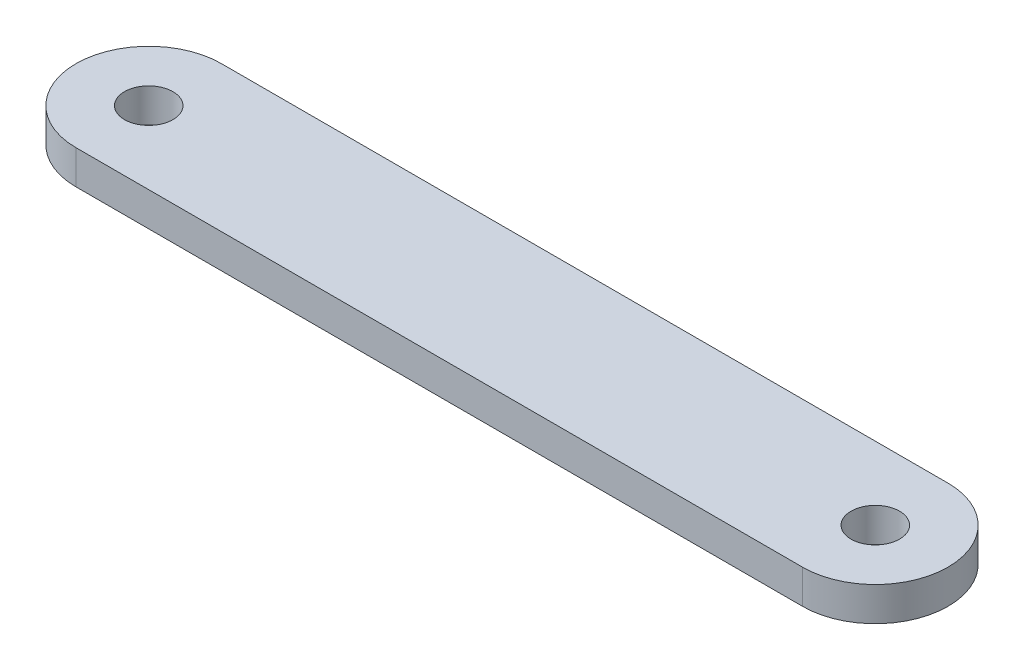
ISO-10303-21;
HEADER;
FILE_DESCRIPTION(('STEP AP214'),'2;1');
FILE_NAME('part.step','',(''),(''),'','','');
FILE_SCHEMA(('AUTOMOTIVE_DESIGN { 1 0 10303 214 1 1 1 1 }'));
ENDSEC;
DATA;
#1=APPLICATION_CONTEXT('core data for automotive mechanical design processes');
#2=APPLICATION_PROTOCOL_DEFINITION('international standard','automotive_design',2000,#1);
#3=PRODUCT_CONTEXT('',#1,'mechanical');
#4=PRODUCT('Part','Part','',(#3));
#5=PRODUCT_RELATED_PRODUCT_CATEGORY('part','',(#4));
#6=PRODUCT_DEFINITION_FORMATION('','',#4);
#7=PRODUCT_DEFINITION_CONTEXT('part definition',#1,'design');
#8=PRODUCT_DEFINITION('design','',#6,#7);
#9=PRODUCT_DEFINITION_SHAPE('','',#8);
#10=(LENGTH_UNIT() NAMED_UNIT(*) SI_UNIT(.MILLI.,.METRE.));
#11=(NAMED_UNIT(*) PLANE_ANGLE_UNIT() SI_UNIT($,.RADIAN.));
#12=(NAMED_UNIT(*) SI_UNIT($,.STERADIAN.) SOLID_ANGLE_UNIT());
#13=UNCERTAINTY_MEASURE_WITH_UNIT(LENGTH_MEASURE(1.E-05),#10,'distance_accuracy_value','');
#14=(GEOMETRIC_REPRESENTATION_CONTEXT(3) GLOBAL_UNCERTAINTY_ASSIGNED_CONTEXT((#13)) GLOBAL_UNIT_ASSIGNED_CONTEXT((#10,
#11,#12)) REPRESENTATION_CONTEXT('',''));
#15=CARTESIAN_POINT('',(0.,0.,0.));
#16=DIRECTION('',(0.,0.,1.));
#17=DIRECTION('',(1.,0.,0.));
#18=AXIS2_PLACEMENT_3D('',#15,#16,#17);
#19=CARTESIAN_POINT('',(0.,7.,0.));
#20=DIRECTION('',(0.,1.,0.));
#21=DIRECTION('',(0.,0.,1.));
#22=AXIS2_PLACEMENT_3D('',#19,#20,#21);
#23=PLANE('',#22);
#24=CARTESIAN_POINT('',(0.,7.,0.));
#25=DIRECTION('',(0.,1.,0.));
#26=DIRECTION('',(0.,0.,1.));
#27=AXIS2_PLACEMENT_3D('',#24,#25,#26);
#28=CIRCLE('',#27,5.);
#29=CARTESIAN_POINT('',(0.,7.,5.));
#30=VERTEX_POINT('',#29);
#31=EDGE_CURVE('E98',#30,#30,#28,.T.);
#32=ORIENTED_EDGE('',*,*,#31,.F.);
#33=EDGE_LOOP('',(#32));
#34=FACE_BOUND('',#33,.T.);
#35=CARTESIAN_POINT('',(0.,7.,0.));
#36=DIRECTION('',(0.,1.,0.));
#37=DIRECTION('',(0.,0.,1.));
#38=AXIS2_PLACEMENT_3D('',#35,#36,#37);
#39=CIRCLE('',#38,15.);
#40=CARTESIAN_POINT('',(0.,7.,-15.));
#41=VERTEX_POINT('',#40);
#42=CARTESIAN_POINT('',(0.,7.,15.));
#43=VERTEX_POINT('',#42);
#44=EDGE_CURVE('E83',#41,#43,#39,.T.);
#45=ORIENTED_EDGE('',*,*,#44,.T.);
#46=DIRECTION('',(1.,0.,0.));
#47=VECTOR('',#46,1.);
#48=CARTESIAN_POINT('',(0.,7.,15.));
#49=LINE('',#48,#47);
#50=CARTESIAN_POINT('',(149.801569260594,7.,15.));
#51=VERTEX_POINT('',#50);
#52=EDGE_CURVE('E78',#43,#51,#49,.T.);
#53=ORIENTED_EDGE('',*,*,#52,.T.);
#54=CARTESIAN_POINT('',(149.801569260594,7.,0.));
#55=DIRECTION('',(0.,1.,0.));
#56=DIRECTION('',(0.,0.,1.));
#57=AXIS2_PLACEMENT_3D('',#54,#55,#56);
#58=CIRCLE('',#57,15.);
#59=CARTESIAN_POINT('',(149.801569260594,7.,-15.));
#60=VERTEX_POINT('',#59);
#61=EDGE_CURVE('E81',#51,#60,#58,.T.);
#62=ORIENTED_EDGE('',*,*,#61,.T.);
#63=DIRECTION('',(-1.,0.,0.));
#64=VECTOR('',#63,1.);
#65=CARTESIAN_POINT('',(0.,7.,-15.));
#66=LINE('',#65,#64);
#67=EDGE_CURVE('E48',#60,#41,#66,.T.);
#68=ORIENTED_EDGE('',*,*,#67,.T.);
#69=EDGE_LOOP('',(#45,#53,#62,#68));
#70=FACE_BOUND('',#69,.T.);
#71=CARTESIAN_POINT('',(149.801569260594,7.,0.));
#72=DIRECTION('',(0.,1.,0.));
#73=DIRECTION('',(0.,0.,1.));
#74=AXIS2_PLACEMENT_3D('',#71,#72,#73);
#75=CIRCLE('',#74,4.99999999999999);
#76=CARTESIAN_POINT('',(149.801569260594,7.,4.99999999999999));
#77=VERTEX_POINT('',#76);
#78=EDGE_CURVE('E113',#77,#77,#75,.T.);
#79=ORIENTED_EDGE('',*,*,#78,.F.);
#80=EDGE_LOOP('',(#79));
#81=FACE_BOUND('',#80,.T.);
#82=ADVANCED_FACE('F31',(#34,#70,#81),#23,.T.);
#83=CARTESIAN_POINT('',(0.,0.,0.));
#84=DIRECTION('',(0.,1.,0.));
#85=DIRECTION('',(0.,0.,1.));
#86=AXIS2_PLACEMENT_3D('',#83,#84,#85);
#87=PLANE('',#86);
#88=CARTESIAN_POINT('',(0.,0.,0.));
#89=DIRECTION('',(0.,1.,0.));
#90=DIRECTION('',(0.,0.,1.));
#91=AXIS2_PLACEMENT_3D('',#88,#89,#90);
#92=CIRCLE('',#91,5.);
#93=CARTESIAN_POINT('',(0.,0.,5.));
#94=VERTEX_POINT('',#93);
#95=EDGE_CURVE('E110',#94,#94,#92,.T.);
#96=ORIENTED_EDGE('',*,*,#95,.T.);
#97=EDGE_LOOP('',(#96));
#98=FACE_BOUND('',#97,.T.);
#99=CARTESIAN_POINT('',(0.,0.,0.));
#100=DIRECTION('',(0.,1.,0.));
#101=DIRECTION('',(0.,0.,1.));
#102=AXIS2_PLACEMENT_3D('',#99,#100,#101);
#103=CIRCLE('',#102,15.);
#104=CARTESIAN_POINT('',(0.,0.,-15.));
#105=VERTEX_POINT('',#104);
#106=CARTESIAN_POINT('',(0.,0.,15.));
#107=VERTEX_POINT('',#106);
#108=EDGE_CURVE('E95',#105,#107,#103,.T.);
#109=ORIENTED_EDGE('',*,*,#108,.F.);
#110=DIRECTION('',(-1.,0.,0.));
#111=VECTOR('',#110,1.);
#112=CARTESIAN_POINT('',(0.,0.,-15.));
#113=LINE('',#112,#111);
#114=CARTESIAN_POINT('',(149.801569260594,0.,-15.));
#115=VERTEX_POINT('',#114);
#116=EDGE_CURVE('E71',#115,#105,#113,.T.);
#117=ORIENTED_EDGE('',*,*,#116,.F.);
#118=CARTESIAN_POINT('',(149.801569260594,0.,0.));
#119=DIRECTION('',(0.,1.,0.));
#120=DIRECTION('',(0.,0.,1.));
#121=AXIS2_PLACEMENT_3D('',#118,#119,#120);
#122=CIRCLE('',#121,15.);
#123=CARTESIAN_POINT('',(149.801569260594,0.,15.));
#124=VERTEX_POINT('',#123);
#125=EDGE_CURVE('E65',#124,#115,#122,.T.);
#126=ORIENTED_EDGE('',*,*,#125,.F.);
#127=DIRECTION('',(1.,0.,0.));
#128=VECTOR('',#127,1.);
#129=CARTESIAN_POINT('',(0.,0.,15.));
#130=LINE('',#129,#128);
#131=EDGE_CURVE('E87',#107,#124,#130,.T.);
#132=ORIENTED_EDGE('',*,*,#131,.F.);
#133=EDGE_LOOP('',(#109,#117,#126,#132));
#134=FACE_BOUND('',#133,.T.);
#135=CARTESIAN_POINT('',(149.801569260594,0.,0.));
#136=DIRECTION('',(0.,1.,0.));
#137=DIRECTION('',(0.,0.,1.));
#138=AXIS2_PLACEMENT_3D('',#135,#136,#137);
#139=CIRCLE('',#138,4.99999999999999);
#140=CARTESIAN_POINT('',(149.801569260594,0.,4.99999999999999));
#141=VERTEX_POINT('',#140);
#142=EDGE_CURVE('E116',#141,#141,#139,.T.);
#143=ORIENTED_EDGE('',*,*,#142,.T.);
#144=EDGE_LOOP('',(#143));
#145=FACE_BOUND('',#144,.T.);
#146=ADVANCED_FACE('F106',(#98,#134,#145),#87,.F.);
#147=CARTESIAN_POINT('',(0.,7.,0.));
#148=DIRECTION('',(0.,-1.,0.));
#149=DIRECTION('',(0.,0.,-1.));
#150=AXIS2_PLACEMENT_3D('',#147,#148,#149);
#151=CYLINDRICAL_SURFACE('',#150,15.);
#152=ORIENTED_EDGE('',*,*,#108,.T.);
#153=DIRECTION('',(0.,-1.,0.));
#154=VECTOR('',#153,1.);
#155=CARTESIAN_POINT('',(0.,7.,15.));
#156=LINE('',#155,#154);
#157=EDGE_CURVE('E11',#43,#107,#156,.T.);
#158=ORIENTED_EDGE('',*,*,#157,.F.);
#159=ORIENTED_EDGE('',*,*,#44,.F.);
#160=DIRECTION('',(0.,-1.,0.));
#161=VECTOR('',#160,1.);
#162=CARTESIAN_POINT('',(0.,7.,-15.));
#163=LINE('',#162,#161);
#164=EDGE_CURVE('E91',#41,#105,#163,.T.);
#165=ORIENTED_EDGE('',*,*,#164,.T.);
#166=EDGE_LOOP('',(#152,#158,#159,#165));
#167=FACE_BOUND('',#166,.T.);
#168=ADVANCED_FACE('F33',(#167),#151,.T.);
#169=CARTESIAN_POINT('',(0.,7.,15.));
#170=DIRECTION('',(0.,0.,-1.));
#171=DIRECTION('',(-1.,0.,0.));
#172=AXIS2_PLACEMENT_3D('',#169,#170,#171);
#173=PLANE('',#172);
#174=ORIENTED_EDGE('',*,*,#131,.T.);
#175=DIRECTION('',(0.,-1.,0.));
#176=VECTOR('',#175,1.);
#177=CARTESIAN_POINT('',(149.801569260594,7.,15.));
#178=LINE('',#177,#176);
#179=EDGE_CURVE('E40',#51,#124,#178,.T.);
#180=ORIENTED_EDGE('',*,*,#179,.F.);
#181=ORIENTED_EDGE('',*,*,#52,.F.);
#182=ORIENTED_EDGE('',*,*,#157,.T.);
#183=EDGE_LOOP('',(#174,#180,#181,#182));
#184=FACE_BOUND('',#183,.T.);
#185=ADVANCED_FACE('F86',(#184),#173,.F.);
#186=CARTESIAN_POINT('',(149.801569260594,7.,0.));
#187=DIRECTION('',(0.,-1.,0.));
#188=DIRECTION('',(0.,0.,-1.));
#189=AXIS2_PLACEMENT_3D('',#186,#187,#188);
#190=CYLINDRICAL_SURFACE('',#189,15.);
#191=ORIENTED_EDGE('',*,*,#125,.T.);
#192=DIRECTION('',(0.,-1.,0.));
#193=VECTOR('',#192,1.);
#194=CARTESIAN_POINT('',(149.801569260594,7.,-15.));
#195=LINE('',#194,#193);
#196=EDGE_CURVE('E88',#60,#115,#195,.T.);
#197=ORIENTED_EDGE('',*,*,#196,.F.);
#198=ORIENTED_EDGE('',*,*,#61,.F.);
#199=ORIENTED_EDGE('',*,*,#179,.T.);
#200=EDGE_LOOP('',(#191,#197,#198,#199));
#201=FACE_BOUND('',#200,.T.);
#202=ADVANCED_FACE('F89',(#201),#190,.T.);
#203=CARTESIAN_POINT('',(0.,7.,-15.));
#204=DIRECTION('',(0.,0.,1.));
#205=DIRECTION('',(1.,0.,0.));
#206=AXIS2_PLACEMENT_3D('',#203,#204,#205);
#207=PLANE('',#206);
#208=ORIENTED_EDGE('',*,*,#116,.T.);
#209=ORIENTED_EDGE('',*,*,#164,.F.);
#210=ORIENTED_EDGE('',*,*,#67,.F.);
#211=ORIENTED_EDGE('',*,*,#196,.T.);
#212=EDGE_LOOP('',(#208,#209,#210,#211));
#213=FACE_BOUND('',#212,.T.);
#214=ADVANCED_FACE('F103',(#213),#207,.F.);
#215=CARTESIAN_POINT('',(0.,7.,0.));
#216=DIRECTION('',(0.,-1.,0.));
#217=DIRECTION('',(0.,0.,-1.));
#218=AXIS2_PLACEMENT_3D('',#215,#216,#217);
#219=CYLINDRICAL_SURFACE('',#218,5.);
#220=ORIENTED_EDGE('',*,*,#31,.T.);
#221=EDGE_LOOP('',(#220));
#222=FACE_BOUND('',#221,.T.);
#223=ORIENTED_EDGE('',*,*,#95,.F.);
#224=EDGE_LOOP('',(#223));
#225=FACE_BOUND('',#224,.T.);
#226=ADVANCED_FACE('F134',(#222,#225),#219,.F.);
#227=CARTESIAN_POINT('',(149.801569260594,7.,0.));
#228=DIRECTION('',(0.,-1.,0.));
#229=DIRECTION('',(0.,0.,-1.));
#230=AXIS2_PLACEMENT_3D('',#227,#228,#229);
#231=CYLINDRICAL_SURFACE('',#230,4.99999999999999);
#232=ORIENTED_EDGE('',*,*,#78,.T.);
#233=EDGE_LOOP('',(#232));
#234=FACE_BOUND('',#233,.T.);
#235=ORIENTED_EDGE('',*,*,#142,.F.);
#236=EDGE_LOOP('',(#235));
#237=FACE_BOUND('',#236,.T.);
#238=ADVANCED_FACE('F122',(#234,#237),#231,.F.);
#239=CLOSED_SHELL('',(#82,#146,#168,#185,#202,#214,#226,#238));
#240=MANIFOLD_SOLID_BREP('B2',#239);
#241=ADVANCED_BREP_SHAPE_REPRESENTATION('',(#18,#240),#14);
#242=SHAPE_DEFINITION_REPRESENTATION(#9,#241);
ENDSEC;
END-ISO-10303-21;
